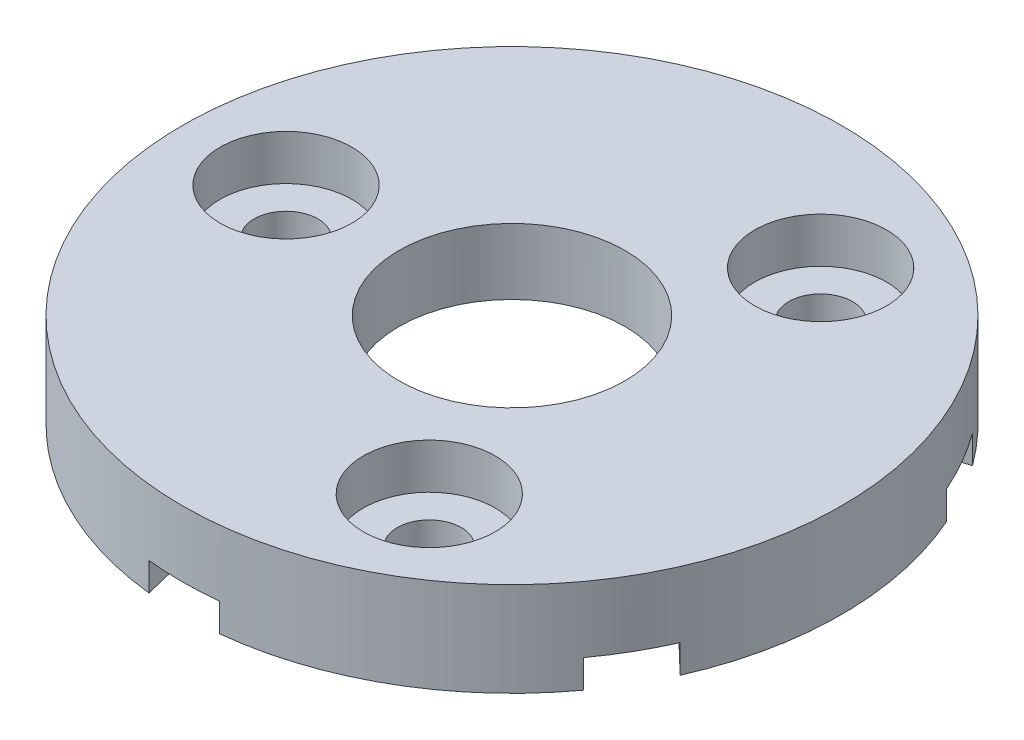
ISO-10303-21;
HEADER;
FILE_DESCRIPTION(('STEP AP214'),'2;1');
FILE_NAME('part.step','',(''),(''),'','','');
FILE_SCHEMA(('AUTOMOTIVE_DESIGN { 1 0 10303 214 1 1 1 1 }'));
ENDSEC;
DATA;
#1=APPLICATION_CONTEXT('core data for automotive mechanical design processes');
#2=APPLICATION_PROTOCOL_DEFINITION('international standard','automotive_design',2000,#1);
#3=PRODUCT_CONTEXT('',#1,'mechanical');
#4=PRODUCT('Part','Part','',(#3));
#5=PRODUCT_RELATED_PRODUCT_CATEGORY('part','',(#4));
#6=PRODUCT_DEFINITION_FORMATION('','',#4);
#7=PRODUCT_DEFINITION_CONTEXT('part definition',#1,'design');
#8=PRODUCT_DEFINITION('design','',#6,#7);
#9=PRODUCT_DEFINITION_SHAPE('','',#8);
#10=(LENGTH_UNIT() NAMED_UNIT(*) SI_UNIT(.MILLI.,.METRE.));
#11=(NAMED_UNIT(*) PLANE_ANGLE_UNIT() SI_UNIT($,.RADIAN.));
#12=(NAMED_UNIT(*) SI_UNIT($,.STERADIAN.) SOLID_ANGLE_UNIT());
#13=UNCERTAINTY_MEASURE_WITH_UNIT(LENGTH_MEASURE(1.E-05),#10,'distance_accuracy_value','');
#14=(GEOMETRIC_REPRESENTATION_CONTEXT(3) GLOBAL_UNCERTAINTY_ASSIGNED_CONTEXT((#13)) GLOBAL_UNIT_ASSIGNED_CONTEXT((#10,
#11,#12)) REPRESENTATION_CONTEXT('',''));
#15=CARTESIAN_POINT('',(0.,0.,0.));
#16=DIRECTION('',(0.,0.,1.));
#17=DIRECTION('',(1.,0.,0.));
#18=AXIS2_PLACEMENT_3D('',#15,#16,#17);
#19=CARTESIAN_POINT('',(0.,0.,0.));
#20=DIRECTION('',(0.,1.,0.));
#21=DIRECTION('',(0.,0.,1.));
#22=AXIS2_PLACEMENT_3D('',#19,#20,#21);
#23=PLANE('',#22);
#24=CARTESIAN_POINT('',(0.,0.,0.));
#25=DIRECTION('',(0.,1.,0.));
#26=DIRECTION('',(0.,0.,1.));
#27=AXIS2_PLACEMENT_3D('',#24,#25,#26);
#28=CIRCLE('',#27,17.5);
#29=CARTESIAN_POINT('',(-14.1306033832012,0.,10.32356760169));
#30=VERTEX_POINT('',#29);
#31=CARTESIAN_POINT('',(-1.87517010914893,0.,17.3992453014996));
#32=VERTEX_POINT('',#31);
#33=EDGE_CURVE('E323',#30,#32,#28,.T.);
#34=ORIENTED_EDGE('',*,*,#33,.F.);
#35=DIRECTION('',(-0.960578554441124,0.,0.278008706244606));
#36=VECTOR('',#35,1.);
#37=CARTESIAN_POINT('',(1.30297054408815,0.,5.85681378918936));
#38=LINE('',#37,#36);
#39=CARTESIAN_POINT('',(-4.32120826661401,0.,7.48455226786208));
#40=VERTEX_POINT('',#39);
#41=EDGE_CURVE('E222',#40,#30,#38,.T.);
#42=ORIENTED_EDGE('',*,*,#41,.F.);
#43=DIRECTION('',(-0.239526675139486,0.,-0.970889783598851));
#44=VECTOR('',#43,1.);
#45=CARTESIAN_POINT('',(0.,0.,25.));
#46=LINE('',#45,#44);
#47=EDGE_CURVE('E272',#32,#40,#46,.T.);
#48=ORIENTED_EDGE('',*,*,#47,.F.);
#49=EDGE_LOOP('',(#34,#42,#48));
#50=FACE_BOUND('',#49,.T.);
#51=ADVANCED_FACE('F33',(#50),#23,.F.);
#52=CARTESIAN_POINT('',(-12.,0.,0.));
#53=DIRECTION('',(0.,1.,0.));
#54=DIRECTION('',(0.,0.,1.));
#55=AXIS2_PLACEMENT_3D('',#52,#53,#54);
#56=CIRCLE('',#55,1.7);
#57=CARTESIAN_POINT('',(-12.,0.,1.7));
#58=VERTEX_POINT('',#57);
#59=EDGE_CURVE('E320',#58,#58,#56,.T.);
#60=ORIENTED_EDGE('',*,*,#59,.T.);
#61=EDGE_LOOP('',(#60));
#62=FACE_BOUND('',#61,.T.);
#63=DIRECTION('',(-0.721051879301635,0.,-0.692881077354246));
#64=VECTOR('',#63,1.);
#65=CARTESIAN_POINT('',(-4.42066425462892,0.,4.05681248615784));
#66=LINE('',#65,#64);
#67=CARTESIAN_POINT('',(-8.642416533228,0.,0.));
#68=VERTEX_POINT('',#67);
#69=CARTESIAN_POINT('',(-16.0057734923501,0.,-7.07567769980965));
#70=VERTEX_POINT('',#69);
#71=EDGE_CURVE('E210',#68,#70,#66,.T.);
#72=ORIENTED_EDGE('',*,*,#71,.F.);
#73=DIRECTION('',(0.72105187930164,0.,-0.692881077354241));
#74=VECTOR('',#73,1.);
#75=CARTESIAN_POINT('',(-21.650635094611,0.,12.5));
#76=LINE('',#75,#74);
#77=CARTESIAN_POINT('',(-16.0057734923501,0.,7.07567769980954));
#78=VERTEX_POINT('',#77);
#79=EDGE_CURVE('E227',#78,#68,#76,.T.);
#80=ORIENTED_EDGE('',*,*,#79,.F.);
#81=EDGE_CURVE('E330',#70,#78,#28,.T.);
#82=ORIENTED_EDGE('',*,*,#81,.F.);
#83=EDGE_LOOP('',(#72,#80,#82));
#84=FACE_BOUND('',#83,.T.);
#85=ADVANCED_FACE('F372',(#62,#84),#23,.F.);
#86=DIRECTION('',(0.239526675139486,0.,-0.970889783598851));
#87=VECTOR('',#86,1.);
#88=CARTESIAN_POINT('',(-5.72363479871706,0.,-1.8000013030315));
#89=LINE('',#88,#87);
#90=CARTESIAN_POINT('',(-4.321208266614,0.,-7.48455226786212));
#91=VERTEX_POINT('',#90);
#92=CARTESIAN_POINT('',(-1.87517010914893,0.,-17.3992453014996));
#93=VERTEX_POINT('',#92);
#94=EDGE_CURVE('E198',#91,#93,#89,.T.);
#95=ORIENTED_EDGE('',*,*,#94,.F.);
#96=DIRECTION('',(0.960578554441123,0.,0.278008706244613));
#97=VECTOR('',#96,1.);
#98=CARTESIAN_POINT('',(-21.6506350946109,0.,-12.5000000000001));
#99=LINE('',#98,#97);
#100=CARTESIAN_POINT('',(-14.1306033832011,0.,-10.3235676016901));
#101=VERTEX_POINT('',#100);
#102=EDGE_CURVE('E215',#101,#91,#99,.T.);
#103=ORIENTED_EDGE('',*,*,#102,.F.);
#104=EDGE_CURVE('E334',#93,#101,#28,.T.);
#105=ORIENTED_EDGE('',*,*,#104,.F.);
#106=EDGE_LOOP('',(#95,#103,#105));
#107=FACE_BOUND('',#106,.T.);
#108=ADVANCED_FACE('F370',(#107),#23,.F.);
#109=CARTESIAN_POINT('',(6.00000000000005,0.,-10.3923048454132));
#110=DIRECTION('',(0.,1.,0.));
#111=DIRECTION('',(0.,0.,1.));
#112=AXIS2_PLACEMENT_3D('',#109,#110,#111);
#113=CIRCLE('',#112,1.7);
#114=CARTESIAN_POINT('',(6.00000000000005,0.,-8.69230484541324));
#115=VERTEX_POINT('',#114);
#116=EDGE_CURVE('E308',#115,#115,#113,.T.);
#117=ORIENTED_EDGE('',*,*,#116,.T.);
#118=EDGE_LOOP('',(#117));
#119=FACE_BOUND('',#118,.T.);
#120=DIRECTION('',(0.960578554441126,0.,-0.278008706244599));
#121=VECTOR('',#120,1.);
#122=CARTESIAN_POINT('',(-1.30297054408811,0.,-5.85681378918937));
#123=LINE('',#122,#121);
#124=CARTESIAN_POINT('',(4.32120826661402,0.,-7.48455226786204));
#125=VERTEX_POINT('',#124);
#126=CARTESIAN_POINT('',(14.1306033832013,0.,-10.3235676016899));
#127=VERTEX_POINT('',#126);
#128=EDGE_CURVE('E172',#125,#127,#123,.T.);
#129=ORIENTED_EDGE('',*,*,#128,.F.);
#130=DIRECTION('',(0.239526675139486,0.,0.970889783598851));
#131=VECTOR('',#130,1.);
#132=CARTESIAN_POINT('',(0.,0.,-25.));
#133=LINE('',#132,#131);
#134=CARTESIAN_POINT('',(1.87517010914893,0.,-17.3992453014996));
#135=VERTEX_POINT('',#134);
#136=EDGE_CURVE('E203',#135,#125,#133,.T.);
#137=ORIENTED_EDGE('',*,*,#136,.F.);
#138=EDGE_CURVE('E329',#127,#135,#28,.T.);
#139=ORIENTED_EDGE('',*,*,#138,.F.);
#140=EDGE_LOOP('',(#129,#137,#139));
#141=FACE_BOUND('',#140,.T.);
#142=ADVANCED_FACE('F345',(#119,#141),#23,.F.);
#143=DIRECTION('',(0.72105187930163,0.,0.692881077354251));
#144=VECTOR('',#143,1.);
#145=CARTESIAN_POINT('',(4.42066425462895,0.,-4.05681248615781));
#146=LINE('',#145,#144);
#147=CARTESIAN_POINT('',(8.642416533228,0.,0.));
#148=VERTEX_POINT('',#147);
#149=CARTESIAN_POINT('',(16.00577349235,0.,7.07567769980976));
#150=VERTEX_POINT('',#149);
#151=EDGE_CURVE('E176',#148,#150,#146,.T.);
#152=ORIENTED_EDGE('',*,*,#151,.F.);
#153=DIRECTION('',(-0.721051879301645,0.,0.692881077354236));
#154=VECTOR('',#153,1.);
#155=CARTESIAN_POINT('',(21.6506350946111,0.,-12.4999999999998));
#156=LINE('',#155,#154);
#157=CARTESIAN_POINT('',(16.0057734923502,0.,-7.07567769980942));
#158=VERTEX_POINT('',#157);
#159=EDGE_CURVE('E159',#158,#148,#156,.T.);
#160=ORIENTED_EDGE('',*,*,#159,.F.);
#161=EDGE_CURVE('E183',#150,#158,#28,.T.);
#162=ORIENTED_EDGE('',*,*,#161,.F.);
#163=EDGE_LOOP('',(#152,#160,#162));
#164=FACE_BOUND('',#163,.T.);
#165=ADVANCED_FACE('F182',(#164),#23,.F.);
#166=CARTESIAN_POINT('',(0.,5.,0.));
#167=DIRECTION('',(0.,-1.,0.));
#168=DIRECTION('',(0.,0.,-1.));
#169=AXIS2_PLACEMENT_3D('',#166,#167,#168);
#170=CYLINDRICAL_SURFACE('',#169,17.5);
#171=CARTESIAN_POINT('',(0.,5.,0.));
#172=DIRECTION('',(0.,1.,0.));
#173=DIRECTION('',(0.,0.,1.));
#174=AXIS2_PLACEMENT_3D('',#171,#172,#173);
#175=CIRCLE('',#174,17.5);
#176=CARTESIAN_POINT('',(0.,5.,17.5));
#177=VERTEX_POINT('',#176);
#178=EDGE_CURVE('E41',#177,#177,#175,.T.);
#179=ORIENTED_EDGE('',*,*,#178,.F.);
#180=EDGE_LOOP('',(#179));
#181=FACE_BOUND('',#180,.T.);
#182=CARTESIAN_POINT('',(0.,1.5,0.));
#183=DIRECTION('',(0.,1.,0.));
#184=DIRECTION('',(0.,0.,1.));
#185=AXIS2_PLACEMENT_3D('',#182,#183,#184);
#186=CIRCLE('',#185,17.5);
#187=CARTESIAN_POINT('',(-16.0057734923501,1.5,7.07567769980954));
#188=VERTEX_POINT('',#187);
#189=CARTESIAN_POINT('',(-14.1306033832012,1.5,10.32356760169));
#190=VERTEX_POINT('',#189);
#191=EDGE_CURVE('E243',#188,#190,#186,.T.);
#192=ORIENTED_EDGE('',*,*,#191,.T.);
#193=DIRECTION('',(0.,-1.,0.));
#194=VECTOR('',#193,1.);
#195=CARTESIAN_POINT('',(-14.1306033832012,5.,10.32356760169));
#196=LINE('',#195,#194);
#197=EDGE_CURVE('E240',#190,#30,#196,.T.);
#198=ORIENTED_EDGE('',*,*,#197,.T.);
#199=ORIENTED_EDGE('',*,*,#33,.T.);
#200=DIRECTION('',(0.,-1.,0.));
#201=VECTOR('',#200,1.);
#202=CARTESIAN_POINT('',(-1.87517010914892,5.,17.3992453014996));
#203=LINE('',#202,#201);
#204=CARTESIAN_POINT('',(-1.87517010914893,1.5,17.3992453014996));
#205=VERTEX_POINT('',#204);
#206=EDGE_CURVE('E278',#32,#205,#203,.F.);
#207=ORIENTED_EDGE('',*,*,#206,.T.);
#208=CARTESIAN_POINT('',(0.,1.5,0.));
#209=DIRECTION('',(0.,1.,0.));
#210=DIRECTION('',(0.,0.,1.));
#211=AXIS2_PLACEMENT_3D('',#208,#209,#210);
#212=CIRCLE('',#211,17.5);
#213=CARTESIAN_POINT('',(1.87517010914893,1.5,17.3992453014996));
#214=VERTEX_POINT('',#213);
#215=EDGE_CURVE('E48',#205,#214,#212,.T.);
#216=ORIENTED_EDGE('',*,*,#215,.T.);
#217=DIRECTION('',(0.,-1.,0.));
#218=VECTOR('',#217,1.);
#219=CARTESIAN_POINT('',(1.87517010914892,5.,17.3992453014996));
#220=LINE('',#219,#218);
#221=CARTESIAN_POINT('',(1.87517010914893,0.,17.3992453014996));
#222=VERTEX_POINT('',#221);
#223=EDGE_CURVE('E281',#214,#222,#220,.T.);
#224=ORIENTED_EDGE('',*,*,#223,.T.);
#225=CARTESIAN_POINT('',(14.1306033832011,0.,10.3235676016902));
#226=VERTEX_POINT('',#225);
#227=EDGE_CURVE('E325',#222,#226,#28,.T.);
#228=ORIENTED_EDGE('',*,*,#227,.T.);
#229=DIRECTION('',(0.,-1.,0.));
#230=VECTOR('',#229,1.);
#231=CARTESIAN_POINT('',(14.1306033832011,5.,10.3235676016902));
#232=LINE('',#231,#230);
#233=CARTESIAN_POINT('',(14.1306033832011,1.5,10.3235676016902));
#234=VERTEX_POINT('',#233);
#235=EDGE_CURVE('E234',#226,#234,#232,.F.);
#236=ORIENTED_EDGE('',*,*,#235,.T.);
#237=CARTESIAN_POINT('',(16.00577349235,1.5,7.07567769980976));
#238=VERTEX_POINT('',#237);
#239=EDGE_CURVE('E247',#234,#238,#186,.T.);
#240=ORIENTED_EDGE('',*,*,#239,.T.);
#241=DIRECTION('',(0.,-1.,0.));
#242=VECTOR('',#241,1.);
#243=CARTESIAN_POINT('',(16.00577349235,5.,7.07567769980976));
#244=LINE('',#243,#242);
#245=EDGE_CURVE('E248',#238,#150,#244,.T.);
#246=ORIENTED_EDGE('',*,*,#245,.T.);
#247=ORIENTED_EDGE('',*,*,#161,.T.);
#248=DIRECTION('',(0.,-1.,0.));
#249=VECTOR('',#248,1.);
#250=CARTESIAN_POINT('',(16.0057734923502,5.,-7.07567769980942));
#251=LINE('',#250,#249);
#252=CARTESIAN_POINT('',(16.0057734923502,1.5,-7.07567769980942));
#253=VERTEX_POINT('',#252);
#254=EDGE_CURVE('E166',#158,#253,#251,.F.);
#255=ORIENTED_EDGE('',*,*,#254,.T.);
#256=CARTESIAN_POINT('',(14.1306033832013,1.5,-10.3235676016899));
#257=VERTEX_POINT('',#256);
#258=EDGE_CURVE('E355',#253,#257,#186,.T.);
#259=ORIENTED_EDGE('',*,*,#258,.T.);
#260=DIRECTION('',(0.,-1.,0.));
#261=VECTOR('',#260,1.);
#262=CARTESIAN_POINT('',(14.1306033832013,5.,-10.3235676016899));
#263=LINE('',#262,#261);
#264=EDGE_CURVE('E251',#257,#127,#263,.T.);
#265=ORIENTED_EDGE('',*,*,#264,.T.);
#266=ORIENTED_EDGE('',*,*,#138,.T.);
#267=DIRECTION('',(0.,-1.,0.));
#268=VECTOR('',#267,1.);
#269=CARTESIAN_POINT('',(1.87517010914892,5.,-17.3992453014996));
#270=LINE('',#269,#268);
#271=CARTESIAN_POINT('',(1.87517010914893,1.5,-17.3992453014996));
#272=VERTEX_POINT('',#271);
#273=EDGE_CURVE('E254',#135,#272,#270,.F.);
#274=ORIENTED_EDGE('',*,*,#273,.T.);
#275=CARTESIAN_POINT('',(-1.87517010914893,1.5,-17.3992453014996));
#276=VERTEX_POINT('',#275);
#277=EDGE_CURVE('E356',#272,#276,#186,.T.);
#278=ORIENTED_EDGE('',*,*,#277,.T.);
#279=DIRECTION('',(0.,-1.,0.));
#280=VECTOR('',#279,1.);
#281=CARTESIAN_POINT('',(-1.87517010914892,5.,-17.3992453014996));
#282=LINE('',#281,#280);
#283=EDGE_CURVE('E257',#276,#93,#282,.T.);
#284=ORIENTED_EDGE('',*,*,#283,.T.);
#285=ORIENTED_EDGE('',*,*,#104,.T.);
#286=DIRECTION('',(0.,-1.,0.));
#287=VECTOR('',#286,1.);
#288=CARTESIAN_POINT('',(-14.1306033832011,5.,-10.3235676016901));
#289=LINE('',#288,#287);
#290=CARTESIAN_POINT('',(-14.1306033832011,1.5,-10.3235676016901));
#291=VERTEX_POINT('',#290);
#292=EDGE_CURVE('E260',#101,#291,#289,.F.);
#293=ORIENTED_EDGE('',*,*,#292,.T.);
#294=CARTESIAN_POINT('',(-16.0057734923501,1.5,-7.07567769980965));
#295=VERTEX_POINT('',#294);
#296=EDGE_CURVE('E246',#291,#295,#186,.T.);
#297=ORIENTED_EDGE('',*,*,#296,.T.);
#298=DIRECTION('',(0.,-1.,0.));
#299=VECTOR('',#298,1.);
#300=CARTESIAN_POINT('',(-16.0057734923501,5.,-7.07567769980965));
#301=LINE('',#300,#299);
#302=EDGE_CURVE('E263',#295,#70,#301,.T.);
#303=ORIENTED_EDGE('',*,*,#302,.T.);
#304=ORIENTED_EDGE('',*,*,#81,.T.);
#305=DIRECTION('',(0.,-1.,0.));
#306=VECTOR('',#305,1.);
#307=CARTESIAN_POINT('',(-16.0057734923501,5.,7.07567769980954));
#308=LINE('',#307,#306);
#309=EDGE_CURVE('E266',#78,#188,#308,.F.);
#310=ORIENTED_EDGE('',*,*,#309,.T.);
#311=EDGE_LOOP('',(#192,#198,#199,#207,#216,#224,#228,#236,#240,#246,#247,#255,#259,#265,#266,
#274,#278,#284,#285,#293,#297,#303,#304,#310));
#312=FACE_BOUND('',#311,.T.);
#313=ADVANCED_FACE('F35',(#181,#312),#170,.T.);
#314=CARTESIAN_POINT('',(0.,5.,0.));
#315=DIRECTION('',(0.,1.,0.));
#316=DIRECTION('',(0.,0.,1.));
#317=AXIS2_PLACEMENT_3D('',#314,#315,#316);
#318=PLANE('',#317);
#319=CARTESIAN_POINT('',(0.,5.,0.));
#320=DIRECTION('',(0.,-1.,0.));
#321=DIRECTION('',(0.,0.,-1.));
#322=AXIS2_PLACEMENT_3D('',#319,#320,#321);
#323=CIRCLE('',#322,6.);
#324=CARTESIAN_POINT('',(0.,5.,-6.));
#325=VERTEX_POINT('',#324);
#326=EDGE_CURVE('E284',#325,#325,#323,.T.);
#327=ORIENTED_EDGE('',*,*,#326,.T.);
#328=EDGE_LOOP('',(#327));
#329=FACE_BOUND('',#328,.T.);
#330=CARTESIAN_POINT('',(5.9999999999999,5.,10.3923048454133));
#331=DIRECTION('',(0.,1.,0.));
#332=DIRECTION('',(0.,0.,1.));
#333=AXIS2_PLACEMENT_3D('',#330,#331,#332);
#334=CIRCLE('',#333,3.5);
#335=CARTESIAN_POINT('',(5.9999999999999,5.,13.8923048454133));
#336=VERTEX_POINT('',#335);
#337=EDGE_CURVE('E287',#336,#336,#334,.T.);
#338=ORIENTED_EDGE('',*,*,#337,.F.);
#339=EDGE_LOOP('',(#338));
#340=FACE_BOUND('',#339,.T.);
#341=CARTESIAN_POINT('',(6.00000000000005,5.,-10.3923048454132));
#342=DIRECTION('',(0.,1.,0.));
#343=DIRECTION('',(0.,0.,1.));
#344=AXIS2_PLACEMENT_3D('',#341,#342,#343);
#345=CIRCLE('',#344,3.5);
#346=CARTESIAN_POINT('',(6.00000000000005,5.,-6.89230484541324));
#347=VERTEX_POINT('',#346);
#348=EDGE_CURVE('E299',#347,#347,#345,.T.);
#349=ORIENTED_EDGE('',*,*,#348,.F.);
#350=EDGE_LOOP('',(#349));
#351=FACE_BOUND('',#350,.T.);
#352=CARTESIAN_POINT('',(-12.,5.,0.));
#353=DIRECTION('',(0.,1.,0.));
#354=DIRECTION('',(0.,0.,1.));
#355=AXIS2_PLACEMENT_3D('',#352,#353,#354);
#356=CIRCLE('',#355,3.5);
#357=CARTESIAN_POINT('',(-12.,5.,3.5));
#358=VERTEX_POINT('',#357);
#359=EDGE_CURVE('E311',#358,#358,#356,.T.);
#360=ORIENTED_EDGE('',*,*,#359,.F.);
#361=EDGE_LOOP('',(#360));
#362=FACE_BOUND('',#361,.T.);
#363=ORIENTED_EDGE('',*,*,#178,.T.);
#364=EDGE_LOOP('',(#363));
#365=FACE_BOUND('',#364,.T.);
#366=ADVANCED_FACE('F387',(#329,#340,#351,#362,#365),#318,.T.);
#367=DIRECTION('',(-0.239526675139486,0.,0.970889783598851));
#368=VECTOR('',#367,1.);
#369=CARTESIAN_POINT('',(5.72363479871706,0.,1.8000013030315));
#370=LINE('',#369,#368);
#371=CARTESIAN_POINT('',(4.32120826661398,0.,7.48455226786216));
#372=VERTEX_POINT('',#371);
#373=EDGE_CURVE('E269',#372,#222,#370,.T.);
#374=ORIENTED_EDGE('',*,*,#373,.F.);
#375=DIRECTION('',(-0.960578554441121,0.,-0.27800870624462));
#376=VECTOR('',#375,1.);
#377=CARTESIAN_POINT('',(21.6506350946108,0.,12.5000000000003));
#378=LINE('',#377,#376);
#379=EDGE_CURVE('E184',#226,#372,#378,.T.);
#380=ORIENTED_EDGE('',*,*,#379,.F.);
#381=ORIENTED_EDGE('',*,*,#227,.F.);
#382=EDGE_LOOP('',(#374,#380,#381));
#383=FACE_BOUND('',#382,.T.);
#384=CARTESIAN_POINT('',(5.9999999999999,0.,10.3923048454133));
#385=DIRECTION('',(0.,1.,0.));
#386=DIRECTION('',(0.,0.,1.));
#387=AXIS2_PLACEMENT_3D('',#384,#385,#386);
#388=CIRCLE('',#387,1.7);
#389=CARTESIAN_POINT('',(5.9999999999999,0.,12.0923048454133));
#390=VERTEX_POINT('',#389);
#391=EDGE_CURVE('E296',#390,#390,#388,.T.);
#392=ORIENTED_EDGE('',*,*,#391,.T.);
#393=EDGE_LOOP('',(#392));
#394=FACE_BOUND('',#393,.T.);
#395=ADVANCED_FACE('F379',(#383,#394),#23,.F.);
#396=CARTESIAN_POINT('',(-12.,5.,0.));
#397=DIRECTION('',(0.,1.,0.));
#398=DIRECTION('',(0.,0.,1.));
#399=AXIS2_PLACEMENT_3D('',#396,#397,#398);
#400=CYLINDRICAL_SURFACE('',#399,1.7);
#401=ORIENTED_EDGE('',*,*,#59,.F.);
#402=EDGE_LOOP('',(#401));
#403=FACE_BOUND('',#402,.T.);
#404=CARTESIAN_POINT('',(-12.,2.6,0.));
#405=DIRECTION('',(0.,1.,0.));
#406=DIRECTION('',(0.,0.,1.));
#407=AXIS2_PLACEMENT_3D('',#404,#405,#406);
#408=CIRCLE('',#407,1.7);
#409=CARTESIAN_POINT('',(-12.,2.6,1.7));
#410=VERTEX_POINT('',#409);
#411=EDGE_CURVE('E317',#410,#410,#408,.T.);
#412=ORIENTED_EDGE('',*,*,#411,.T.);
#413=EDGE_LOOP('',(#412));
#414=FACE_BOUND('',#413,.T.);
#415=ADVANCED_FACE('F386',(#403,#414),#400,.F.);
#416=CARTESIAN_POINT('',(-10.3,2.6,0.));
#417=DIRECTION('',(0.,-1.,0.));
#418=DIRECTION('',(0.,0.,-1.));
#419=AXIS2_PLACEMENT_3D('',#416,#417,#418);
#420=PLANE('',#419);
#421=ORIENTED_EDGE('',*,*,#411,.F.);
#422=EDGE_LOOP('',(#421));
#423=FACE_BOUND('',#422,.T.);
#424=CARTESIAN_POINT('',(-12.,2.6,0.));
#425=DIRECTION('',(0.,1.,0.));
#426=DIRECTION('',(0.,0.,1.));
#427=AXIS2_PLACEMENT_3D('',#424,#425,#426);
#428=CIRCLE('',#427,3.5);
#429=CARTESIAN_POINT('',(-12.,2.6,3.5));
#430=VERTEX_POINT('',#429);
#431=EDGE_CURVE('E314',#430,#430,#428,.T.);
#432=ORIENTED_EDGE('',*,*,#431,.T.);
#433=EDGE_LOOP('',(#432));
#434=FACE_BOUND('',#433,.T.);
#435=ADVANCED_FACE('F393',(#423,#434),#420,.F.);
#436=CARTESIAN_POINT('',(-12.,5.,0.));
#437=DIRECTION('',(0.,1.,0.));
#438=DIRECTION('',(0.,0.,1.));
#439=AXIS2_PLACEMENT_3D('',#436,#437,#438);
#440=CYLINDRICAL_SURFACE('',#439,3.5);
#441=ORIENTED_EDGE('',*,*,#431,.F.);
#442=EDGE_LOOP('',(#441));
#443=FACE_BOUND('',#442,.T.);
#444=ORIENTED_EDGE('',*,*,#359,.T.);
#445=EDGE_LOOP('',(#444));
#446=FACE_BOUND('',#445,.T.);
#447=ADVANCED_FACE('F531',(#443,#446),#440,.F.);
#448=CARTESIAN_POINT('',(6.00000000000005,5.,-10.3923048454132));
#449=DIRECTION('',(0.,1.,0.));
#450=DIRECTION('',(0.,0.,1.));
#451=AXIS2_PLACEMENT_3D('',#448,#449,#450);
#452=CYLINDRICAL_SURFACE('',#451,1.7);
#453=ORIENTED_EDGE('',*,*,#116,.F.);
#454=EDGE_LOOP('',(#453));
#455=FACE_BOUND('',#454,.T.);
#456=CARTESIAN_POINT('',(6.00000000000005,2.6,-10.3923048454132));
#457=DIRECTION('',(0.,1.,0.));
#458=DIRECTION('',(0.,0.,1.));
#459=AXIS2_PLACEMENT_3D('',#456,#457,#458);
#460=CIRCLE('',#459,1.7);
#461=CARTESIAN_POINT('',(6.00000000000005,2.6,-8.69230484541324));
#462=VERTEX_POINT('',#461);
#463=EDGE_CURVE('E305',#462,#462,#460,.T.);
#464=ORIENTED_EDGE('',*,*,#463,.T.);
#465=EDGE_LOOP('',(#464));
#466=FACE_BOUND('',#465,.T.);
#467=ADVANCED_FACE('F522',(#455,#466),#452,.F.);
#468=CARTESIAN_POINT('',(7.70000000000005,2.6,-10.3923048454132));
#469=DIRECTION('',(0.,-1.,0.));
#470=DIRECTION('',(0.,0.,-1.));
#471=AXIS2_PLACEMENT_3D('',#468,#469,#470);
#472=PLANE('',#471);
#473=ORIENTED_EDGE('',*,*,#463,.F.);
#474=EDGE_LOOP('',(#473));
#475=FACE_BOUND('',#474,.T.);
#476=CARTESIAN_POINT('',(6.00000000000005,2.6,-10.3923048454132));
#477=DIRECTION('',(0.,1.,0.));
#478=DIRECTION('',(0.,0.,1.));
#479=AXIS2_PLACEMENT_3D('',#476,#477,#478);
#480=CIRCLE('',#479,3.5);
#481=CARTESIAN_POINT('',(6.00000000000005,2.6,-6.89230484541324));
#482=VERTEX_POINT('',#481);
#483=EDGE_CURVE('E302',#482,#482,#480,.T.);
#484=ORIENTED_EDGE('',*,*,#483,.T.);
#485=EDGE_LOOP('',(#484));
#486=FACE_BOUND('',#485,.T.);
#487=ADVANCED_FACE('F513',(#475,#486),#472,.F.);
#488=CARTESIAN_POINT('',(6.00000000000005,5.,-10.3923048454132));
#489=DIRECTION('',(0.,1.,0.));
#490=DIRECTION('',(0.,0.,1.));
#491=AXIS2_PLACEMENT_3D('',#488,#489,#490);
#492=CYLINDRICAL_SURFACE('',#491,3.5);
#493=ORIENTED_EDGE('',*,*,#483,.F.);
#494=EDGE_LOOP('',(#493));
#495=FACE_BOUND('',#494,.T.);
#496=ORIENTED_EDGE('',*,*,#348,.T.);
#497=EDGE_LOOP('',(#496));
#498=FACE_BOUND('',#497,.T.);
#499=ADVANCED_FACE('F504',(#495,#498),#492,.F.);
#500=CARTESIAN_POINT('',(5.9999999999999,5.,10.3923048454133));
#501=DIRECTION('',(0.,1.,0.));
#502=DIRECTION('',(0.,0.,1.));
#503=AXIS2_PLACEMENT_3D('',#500,#501,#502);
#504=CYLINDRICAL_SURFACE('',#503,1.7);
#505=ORIENTED_EDGE('',*,*,#391,.F.);
#506=EDGE_LOOP('',(#505));
#507=FACE_BOUND('',#506,.T.);
#508=CARTESIAN_POINT('',(5.9999999999999,2.6,10.3923048454133));
#509=DIRECTION('',(0.,1.,0.));
#510=DIRECTION('',(0.,0.,1.));
#511=AXIS2_PLACEMENT_3D('',#508,#509,#510);
#512=CIRCLE('',#511,1.7);
#513=CARTESIAN_POINT('',(5.9999999999999,2.6,12.0923048454133));
#514=VERTEX_POINT('',#513);
#515=EDGE_CURVE('E293',#514,#514,#512,.T.);
#516=ORIENTED_EDGE('',*,*,#515,.T.);
#517=EDGE_LOOP('',(#516));
#518=FACE_BOUND('',#517,.T.);
#519=ADVANCED_FACE('F495',(#507,#518),#504,.F.);
#520=CARTESIAN_POINT('',(7.6999999999999,2.6,10.3923048454133));
#521=DIRECTION('',(0.,-1.,0.));
#522=DIRECTION('',(0.,0.,-1.));
#523=AXIS2_PLACEMENT_3D('',#520,#521,#522);
#524=PLANE('',#523);
#525=ORIENTED_EDGE('',*,*,#515,.F.);
#526=EDGE_LOOP('',(#525));
#527=FACE_BOUND('',#526,.T.);
#528=CARTESIAN_POINT('',(5.9999999999999,2.6,10.3923048454133));
#529=DIRECTION('',(0.,1.,0.));
#530=DIRECTION('',(0.,0.,1.));
#531=AXIS2_PLACEMENT_3D('',#528,#529,#530);
#532=CIRCLE('',#531,3.5);
#533=CARTESIAN_POINT('',(5.9999999999999,2.6,13.8923048454133));
#534=VERTEX_POINT('',#533);
#535=EDGE_CURVE('E290',#534,#534,#532,.T.);
#536=ORIENTED_EDGE('',*,*,#535,.T.);
#537=EDGE_LOOP('',(#536));
#538=FACE_BOUND('',#537,.T.);
#539=ADVANCED_FACE('F488',(#527,#538),#524,.F.);
#540=CARTESIAN_POINT('',(5.9999999999999,5.,10.3923048454133));
#541=DIRECTION('',(0.,1.,0.));
#542=DIRECTION('',(0.,0.,1.));
#543=AXIS2_PLACEMENT_3D('',#540,#541,#542);
#544=CYLINDRICAL_SURFACE('',#543,3.5);
#545=ORIENTED_EDGE('',*,*,#535,.F.);
#546=EDGE_LOOP('',(#545));
#547=FACE_BOUND('',#546,.T.);
#548=ORIENTED_EDGE('',*,*,#337,.T.);
#549=EDGE_LOOP('',(#548));
#550=FACE_BOUND('',#549,.T.);
#551=ADVANCED_FACE('F418',(#547,#550),#544,.F.);
#552=CARTESIAN_POINT('',(0.,0.,0.));
#553=DIRECTION('',(0.,-1.,0.));
#554=DIRECTION('',(0.,0.,-1.));
#555=AXIS2_PLACEMENT_3D('',#552,#553,#554);
#556=CYLINDRICAL_SURFACE('',#555,6.);
#557=CARTESIAN_POINT('',(0.,1.5,0.));
#558=DIRECTION('',(0.,1.,0.));
#559=DIRECTION('',(0.,0.,1.));
#560=AXIS2_PLACEMENT_3D('',#557,#558,#559);
#561=CIRCLE('',#560,6.);
#562=CARTESIAN_POINT('',(0.,1.5,6.));
#563=VERTEX_POINT('',#562);
#564=EDGE_CURVE('E11',#563,#563,#561,.F.);
#565=ORIENTED_EDGE('',*,*,#564,.T.);
#566=EDGE_LOOP('',(#565));
#567=FACE_BOUND('',#566,.T.);
#568=ORIENTED_EDGE('',*,*,#326,.F.);
#569=EDGE_LOOP('',(#568));
#570=FACE_BOUND('',#569,.T.);
#571=ADVANCED_FACE('F474',(#567,#570),#556,.F.);
#572=CARTESIAN_POINT('',(5.72363479871706,1.5,1.8000013030315));
#573=DIRECTION('',(0.970889783598851,0.,0.239526675139486));
#574=DIRECTION('',(0.239526675139486,0.,-0.970889783598851));
#575=AXIS2_PLACEMENT_3D('',#572,#573,#574);
#576=PLANE('',#575);
#577=DIRECTION('',(-0.239526675139486,0.,0.970889783598851));
#578=VECTOR('',#577,1.);
#579=CARTESIAN_POINT('',(5.72363479871706,1.5,1.8000013030315));
#580=LINE('',#579,#578);
#581=CARTESIAN_POINT('',(4.32120826661398,1.5,7.48455226786216));
#582=VERTEX_POINT('',#581);
#583=EDGE_CURVE('E53',#582,#214,#580,.T.);
#584=ORIENTED_EDGE('',*,*,#583,.F.);
#585=DIRECTION('',(0.,-1.,0.));
#586=VECTOR('',#585,1.);
#587=CARTESIAN_POINT('',(4.32120826661399,1.5,7.48455226786216));
#588=LINE('',#587,#586);
#589=EDGE_CURVE('E229',#582,#372,#588,.T.);
#590=ORIENTED_EDGE('',*,*,#589,.T.);
#591=ORIENTED_EDGE('',*,*,#373,.T.);
#592=ORIENTED_EDGE('',*,*,#223,.F.);
#593=EDGE_LOOP('',(#584,#590,#591,#592));
#594=FACE_BOUND('',#593,.T.);
#595=ADVANCED_FACE('F465',(#594),#576,.F.);
#596=CARTESIAN_POINT('',(0.,1.5,25.));
#597=DIRECTION('',(-0.970889783598851,0.,0.239526675139486));
#598=DIRECTION('',(0.239526675139486,0.,0.970889783598851));
#599=AXIS2_PLACEMENT_3D('',#596,#597,#598);
#600=PLANE('',#599);
#601=ORIENTED_EDGE('',*,*,#47,.T.);
#602=DIRECTION('',(0.,1.,0.));
#603=VECTOR('',#602,1.);
#604=CARTESIAN_POINT('',(-4.32120826661401,1.5,7.48455226786208));
#605=LINE('',#604,#603);
#606=CARTESIAN_POINT('',(-4.32120826661401,1.5,7.48455226786208));
#607=VERTEX_POINT('',#606);
#608=EDGE_CURVE('E237',#40,#607,#605,.T.);
#609=ORIENTED_EDGE('',*,*,#608,.T.);
#610=DIRECTION('',(-0.239526675139486,0.,-0.970889783598851));
#611=VECTOR('',#610,1.);
#612=CARTESIAN_POINT('',(0.,1.5,25.));
#613=LINE('',#612,#611);
#614=EDGE_CURVE('E271',#205,#607,#613,.T.);
#615=ORIENTED_EDGE('',*,*,#614,.F.);
#616=ORIENTED_EDGE('',*,*,#206,.F.);
#617=EDGE_LOOP('',(#601,#609,#615,#616));
#618=FACE_BOUND('',#617,.T.);
#619=ADVANCED_FACE('F454',(#618),#600,.F.);
#620=CARTESIAN_POINT('',(0.,1.5,0.));
#621=DIRECTION('',(0.,1.,0.));
#622=DIRECTION('',(0.,0.,1.));
#623=AXIS2_PLACEMENT_3D('',#620,#621,#622);
#624=PLANE('',#623);
#625=DIRECTION('',(-0.960578554441121,0.,-0.27800870624462));
#626=VECTOR('',#625,1.);
#627=CARTESIAN_POINT('',(21.6506350946108,1.5,12.5000000000003));
#628=LINE('',#627,#626);
#629=EDGE_CURVE('E180',#234,#582,#628,.T.);
#630=ORIENTED_EDGE('',*,*,#629,.T.);
#631=ORIENTED_EDGE('',*,*,#583,.T.);
#632=ORIENTED_EDGE('',*,*,#215,.F.);
#633=ORIENTED_EDGE('',*,*,#614,.T.);
#634=DIRECTION('',(-0.960578554441124,0.,0.278008706244606));
#635=VECTOR('',#634,1.);
#636=CARTESIAN_POINT('',(1.30297054408815,1.5,5.85681378918936));
#637=LINE('',#636,#635);
#638=EDGE_CURVE('E223',#607,#190,#637,.T.);
#639=ORIENTED_EDGE('',*,*,#638,.T.);
#640=ORIENTED_EDGE('',*,*,#191,.F.);
#641=DIRECTION('',(0.72105187930164,0.,-0.692881077354241));
#642=VECTOR('',#641,1.);
#643=CARTESIAN_POINT('',(-21.650635094611,1.5,12.5));
#644=LINE('',#643,#642);
#645=CARTESIAN_POINT('',(-8.642416533228,1.5,0.));
#646=VERTEX_POINT('',#645);
#647=EDGE_CURVE('E226',#188,#646,#644,.T.);
#648=ORIENTED_EDGE('',*,*,#647,.T.);
#649=DIRECTION('',(-0.721051879301635,0.,-0.692881077354246));
#650=VECTOR('',#649,1.);
#651=CARTESIAN_POINT('',(-4.42066425462892,1.5,4.05681248615784));
#652=LINE('',#651,#650);
#653=EDGE_CURVE('E211',#646,#295,#652,.T.);
#654=ORIENTED_EDGE('',*,*,#653,.T.);
#655=ORIENTED_EDGE('',*,*,#296,.F.);
#656=DIRECTION('',(0.960578554441123,0.,0.278008706244613));
#657=VECTOR('',#656,1.);
#658=CARTESIAN_POINT('',(-21.6506350946109,1.5,-12.5000000000001));
#659=LINE('',#658,#657);
#660=CARTESIAN_POINT('',(-4.321208266614,1.5,-7.48455226786212));
#661=VERTEX_POINT('',#660);
#662=EDGE_CURVE('E214',#291,#661,#659,.T.);
#663=ORIENTED_EDGE('',*,*,#662,.T.);
#664=DIRECTION('',(0.239526675139486,0.,-0.970889783598851));
#665=VECTOR('',#664,1.);
#666=CARTESIAN_POINT('',(-5.72363479871706,1.5,-1.8000013030315));
#667=LINE('',#666,#665);
#668=EDGE_CURVE('E199',#661,#276,#667,.T.);
#669=ORIENTED_EDGE('',*,*,#668,.T.);
#670=ORIENTED_EDGE('',*,*,#277,.F.);
#671=DIRECTION('',(0.239526675139486,0.,0.970889783598851));
#672=VECTOR('',#671,1.);
#673=CARTESIAN_POINT('',(0.,1.5,-25.));
#674=LINE('',#673,#672);
#675=CARTESIAN_POINT('',(4.32120826661402,1.5,-7.48455226786204));
#676=VERTEX_POINT('',#675);
#677=EDGE_CURVE('E202',#272,#676,#674,.T.);
#678=ORIENTED_EDGE('',*,*,#677,.T.);
#679=DIRECTION('',(0.960578554441126,0.,-0.278008706244599));
#680=VECTOR('',#679,1.);
#681=CARTESIAN_POINT('',(-1.30297054408811,1.5,-5.85681378918937));
#682=LINE('',#681,#680);
#683=EDGE_CURVE('E171',#676,#257,#682,.T.);
#684=ORIENTED_EDGE('',*,*,#683,.T.);
#685=ORIENTED_EDGE('',*,*,#258,.F.);
#686=DIRECTION('',(-0.721051879301645,0.,0.692881077354236));
#687=VECTOR('',#686,1.);
#688=CARTESIAN_POINT('',(21.6506350946111,1.5,-12.4999999999998));
#689=LINE('',#688,#687);
#690=CARTESIAN_POINT('',(8.642416533228,1.5,0.));
#691=VERTEX_POINT('',#690);
#692=EDGE_CURVE('E192',#253,#691,#689,.T.);
#693=ORIENTED_EDGE('',*,*,#692,.T.);
#694=DIRECTION('',(0.72105187930163,0.,0.692881077354251));
#695=VECTOR('',#694,1.);
#696=CARTESIAN_POINT('',(4.42066425462895,1.5,-4.05681248615781));
#697=LINE('',#696,#695);
#698=EDGE_CURVE('E179',#691,#238,#697,.T.);
#699=ORIENTED_EDGE('',*,*,#698,.T.);
#700=ORIENTED_EDGE('',*,*,#239,.F.);
#701=EDGE_LOOP('',(#630,#631,#632,#633,#639,#640,#648,#654,#655,#663,#669,#670,#678,#684,#685,
#693,#699,#700));
#702=FACE_BOUND('',#701,.T.);
#703=ORIENTED_EDGE('',*,*,#564,.F.);
#704=EDGE_LOOP('',(#703));
#705=FACE_BOUND('',#704,.T.);
#706=ADVANCED_FACE('F353',(#702,#705),#624,.F.);
#707=CARTESIAN_POINT('',(-21.650635094611,1.5,12.5));
#708=DIRECTION('',(-0.692881077354241,0.,-0.72105187930164));
#709=DIRECTION('',(-0.72105187930164,0.,0.692881077354241));
#710=AXIS2_PLACEMENT_3D('',#707,#708,#709);
#711=PLANE('',#710);
#712=ORIENTED_EDGE('',*,*,#79,.T.);
#713=DIRECTION('',(0.,1.,0.));
#714=VECTOR('',#713,1.);
#715=CARTESIAN_POINT('',(-8.642416533228,1.5,0.));
#716=LINE('',#715,#714);
#717=EDGE_CURVE('E217',#68,#646,#716,.T.);
#718=ORIENTED_EDGE('',*,*,#717,.T.);
#719=ORIENTED_EDGE('',*,*,#647,.F.);
#720=ORIENTED_EDGE('',*,*,#309,.F.);
#721=EDGE_LOOP('',(#712,#718,#719,#720));
#722=FACE_BOUND('',#721,.T.);
#723=ADVANCED_FACE('F453',(#722),#711,.F.);
#724=CARTESIAN_POINT('',(-4.42066425462892,1.5,4.05681248615784));
#725=DIRECTION('',(-0.692881077354246,0.,0.721051879301635));
#726=DIRECTION('',(0.721051879301635,0.,0.692881077354246));
#727=AXIS2_PLACEMENT_3D('',#724,#725,#726);
#728=PLANE('',#727);
#729=ORIENTED_EDGE('',*,*,#653,.F.);
#730=ORIENTED_EDGE('',*,*,#717,.F.);
#731=ORIENTED_EDGE('',*,*,#71,.T.);
#732=ORIENTED_EDGE('',*,*,#302,.F.);
#733=EDGE_LOOP('',(#729,#730,#731,#732));
#734=FACE_BOUND('',#733,.T.);
#735=ADVANCED_FACE('F576',(#734),#728,.F.);
#736=CARTESIAN_POINT('',(-21.6506350946109,1.5,-12.5000000000001));
#737=DIRECTION('',(0.278008706244613,0.,-0.960578554441123));
#738=DIRECTION('',(-0.960578554441123,0.,-0.278008706244613));
#739=AXIS2_PLACEMENT_3D('',#736,#737,#738);
#740=PLANE('',#739);
#741=ORIENTED_EDGE('',*,*,#102,.T.);
#742=DIRECTION('',(0.,1.,0.));
#743=VECTOR('',#742,1.);
#744=CARTESIAN_POINT('',(-4.32120826661399,1.5,-7.48455226786212));
#745=LINE('',#744,#743);
#746=EDGE_CURVE('E205',#91,#661,#745,.T.);
#747=ORIENTED_EDGE('',*,*,#746,.T.);
#748=ORIENTED_EDGE('',*,*,#662,.F.);
#749=ORIENTED_EDGE('',*,*,#292,.F.);
#750=EDGE_LOOP('',(#741,#747,#748,#749));
#751=FACE_BOUND('',#750,.T.);
#752=ADVANCED_FACE('F362',(#751),#740,.F.);
#753=CARTESIAN_POINT('',(-5.72363479871706,1.5,-1.8000013030315));
#754=DIRECTION('',(-0.970889783598851,0.,-0.239526675139486));
#755=DIRECTION('',(-0.239526675139486,0.,0.970889783598851));
#756=AXIS2_PLACEMENT_3D('',#753,#754,#755);
#757=PLANE('',#756);
#758=ORIENTED_EDGE('',*,*,#668,.F.);
#759=ORIENTED_EDGE('',*,*,#746,.F.);
#760=ORIENTED_EDGE('',*,*,#94,.T.);
#761=ORIENTED_EDGE('',*,*,#283,.F.);
#762=EDGE_LOOP('',(#758,#759,#760,#761));
#763=FACE_BOUND('',#762,.T.);
#764=ADVANCED_FACE('F368',(#763),#757,.F.);
#765=CARTESIAN_POINT('',(0.,1.5,-25.));
#766=DIRECTION('',(0.970889783598851,0.,-0.239526675139486));
#767=DIRECTION('',(-0.239526675139486,0.,-0.970889783598851));
#768=AXIS2_PLACEMENT_3D('',#765,#766,#767);
#769=PLANE('',#768);
#770=ORIENTED_EDGE('',*,*,#136,.T.);
#771=DIRECTION('',(0.,1.,0.));
#772=VECTOR('',#771,1.);
#773=CARTESIAN_POINT('',(4.32120826661402,1.5,-7.48455226786204));
#774=LINE('',#773,#772);
#775=EDGE_CURVE('E194',#125,#676,#774,.T.);
#776=ORIENTED_EDGE('',*,*,#775,.T.);
#777=ORIENTED_EDGE('',*,*,#677,.F.);
#778=ORIENTED_EDGE('',*,*,#273,.F.);
#779=EDGE_LOOP('',(#770,#776,#777,#778));
#780=FACE_BOUND('',#779,.T.);
#781=ADVANCED_FACE('F348',(#780),#769,.F.);
#782=CARTESIAN_POINT('',(-1.30297054408811,1.5,-5.85681378918937));
#783=DIRECTION('',(-0.2780087062446,0.,-0.960578554441126));
#784=DIRECTION('',(-0.960578554441126,0.,0.2780087062446));
#785=AXIS2_PLACEMENT_3D('',#782,#783,#784);
#786=PLANE('',#785);
#787=ORIENTED_EDGE('',*,*,#683,.F.);
#788=ORIENTED_EDGE('',*,*,#775,.F.);
#789=ORIENTED_EDGE('',*,*,#128,.T.);
#790=ORIENTED_EDGE('',*,*,#264,.F.);
#791=EDGE_LOOP('',(#787,#788,#789,#790));
#792=FACE_BOUND('',#791,.T.);
#793=ADVANCED_FACE('F352',(#792),#786,.F.);
#794=CARTESIAN_POINT('',(21.6506350946111,1.5,-12.4999999999998));
#795=DIRECTION('',(0.692881077354236,0.,0.721051879301645));
#796=DIRECTION('',(0.721051879301645,0.,-0.692881077354236));
#797=AXIS2_PLACEMENT_3D('',#794,#795,#796);
#798=PLANE('',#797);
#799=ORIENTED_EDGE('',*,*,#159,.T.);
#800=DIRECTION('',(0.,1.,0.));
#801=VECTOR('',#800,1.);
#802=CARTESIAN_POINT('',(8.642416533228,1.5,0.));
#803=LINE('',#802,#801);
#804=EDGE_CURVE('E163',#148,#691,#803,.T.);
#805=ORIENTED_EDGE('',*,*,#804,.T.);
#806=ORIENTED_EDGE('',*,*,#692,.F.);
#807=ORIENTED_EDGE('',*,*,#254,.F.);
#808=EDGE_LOOP('',(#799,#805,#806,#807));
#809=FACE_BOUND('',#808,.T.);
#810=ADVANCED_FACE('F161',(#809),#798,.F.);
#811=CARTESIAN_POINT('',(4.42066425462895,1.5,-4.05681248615781));
#812=DIRECTION('',(0.692881077354251,0.,-0.72105187930163));
#813=DIRECTION('',(-0.72105187930163,0.,-0.692881077354251));
#814=AXIS2_PLACEMENT_3D('',#811,#812,#813);
#815=PLANE('',#814);
#816=ORIENTED_EDGE('',*,*,#698,.F.);
#817=ORIENTED_EDGE('',*,*,#804,.F.);
#818=ORIENTED_EDGE('',*,*,#151,.T.);
#819=ORIENTED_EDGE('',*,*,#245,.F.);
#820=EDGE_LOOP('',(#816,#817,#818,#819));
#821=FACE_BOUND('',#820,.T.);
#822=ADVANCED_FACE('F175',(#821),#815,.F.);
#823=CARTESIAN_POINT('',(1.30297054408815,1.5,5.85681378918936));
#824=DIRECTION('',(0.278008706244606,0.,0.960578554441124));
#825=DIRECTION('',(0.960578554441124,0.,-0.278008706244606));
#826=AXIS2_PLACEMENT_3D('',#823,#824,#825);
#827=PLANE('',#826);
#828=ORIENTED_EDGE('',*,*,#638,.F.);
#829=ORIENTED_EDGE('',*,*,#608,.F.);
#830=ORIENTED_EDGE('',*,*,#41,.T.);
#831=ORIENTED_EDGE('',*,*,#197,.F.);
#832=EDGE_LOOP('',(#828,#829,#830,#831));
#833=FACE_BOUND('',#832,.T.);
#834=ADVANCED_FACE('F620',(#833),#827,.F.);
#835=CARTESIAN_POINT('',(21.6506350946108,1.5,12.5000000000003));
#836=DIRECTION('',(-0.27800870624462,0.,0.960578554441121));
#837=DIRECTION('',(0.960578554441121,0.,0.27800870624462));
#838=AXIS2_PLACEMENT_3D('',#835,#836,#837);
#839=PLANE('',#838);
#840=ORIENTED_EDGE('',*,*,#379,.T.);
#841=ORIENTED_EDGE('',*,*,#589,.F.);
#842=ORIENTED_EDGE('',*,*,#629,.F.);
#843=ORIENTED_EDGE('',*,*,#235,.F.);
#844=EDGE_LOOP('',(#840,#841,#842,#843));
#845=FACE_BOUND('',#844,.T.);
#846=ADVANCED_FACE('F627',(#845),#839,.F.);
#847=CLOSED_SHELL('',(#51,#85,#108,#142,#165,#313,#366,#395,#415,#435,#447,#467,#487,#499,#519,
#539,#551,#571,#595,#619,#706,#723,#735,#752,#764,#781,#793,#810,#822,#834,#846));
#848=MANIFOLD_SOLID_BREP('B2',#847);
#849=ADVANCED_BREP_SHAPE_REPRESENTATION('',(#18,#848),#14);
#850=SHAPE_DEFINITION_REPRESENTATION(#9,#849);
ENDSEC;
END-ISO-10303-21;
